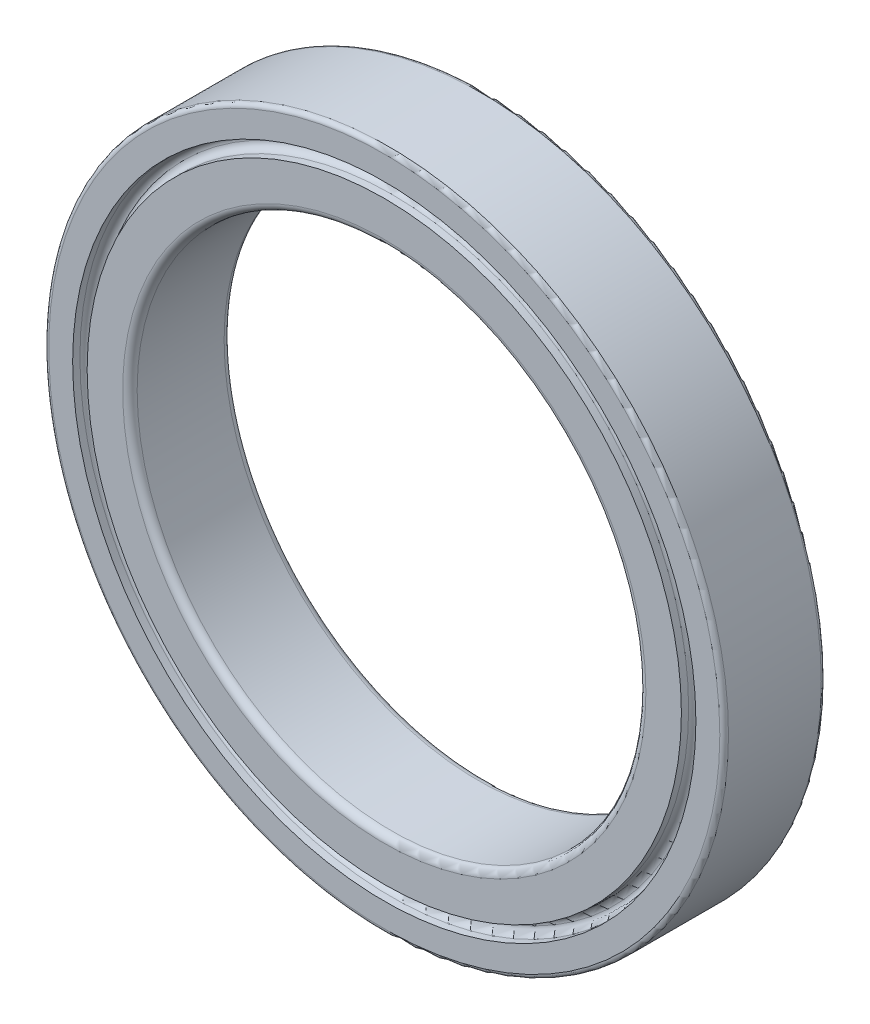
ISO-10303-21;
HEADER;
FILE_DESCRIPTION(('STEP AP214'),'2;1');
FILE_NAME('part.step','',(''),(''),'','','');
FILE_SCHEMA(('AUTOMOTIVE_DESIGN { 1 0 10303 214 1 1 1 1 }'));
ENDSEC;
DATA;
#1=APPLICATION_CONTEXT('core data for automotive mechanical design processes');
#2=APPLICATION_PROTOCOL_DEFINITION('international standard','automotive_design',2000,#1);
#3=PRODUCT_CONTEXT('',#1,'mechanical');
#4=PRODUCT('Part','Part','',(#3));
#5=PRODUCT_RELATED_PRODUCT_CATEGORY('part','',(#4));
#6=PRODUCT_DEFINITION_FORMATION('','',#4);
#7=PRODUCT_DEFINITION_CONTEXT('part definition',#1,'design');
#8=PRODUCT_DEFINITION('design','',#6,#7);
#9=PRODUCT_DEFINITION_SHAPE('','',#8);
#10=(LENGTH_UNIT() NAMED_UNIT(*) SI_UNIT(.MILLI.,.METRE.));
#11=(NAMED_UNIT(*) PLANE_ANGLE_UNIT() SI_UNIT($,.RADIAN.));
#12=(NAMED_UNIT(*) SI_UNIT($,.STERADIAN.) SOLID_ANGLE_UNIT());
#13=UNCERTAINTY_MEASURE_WITH_UNIT(LENGTH_MEASURE(1.E-05),#10,'distance_accuracy_value','');
#14=(GEOMETRIC_REPRESENTATION_CONTEXT(3) GLOBAL_UNCERTAINTY_ASSIGNED_CONTEXT((#13)) GLOBAL_UNIT_ASSIGNED_CONTEXT((#10,
#11,#12)) REPRESENTATION_CONTEXT('',''));
#15=CARTESIAN_POINT('',(0.,0.,0.));
#16=DIRECTION('',(0.,0.,1.));
#17=DIRECTION('',(1.,0.,0.));
#18=AXIS2_PLACEMENT_3D('',#15,#16,#17);
#19=CARTESIAN_POINT('',(0.,0.,0.));
#20=DIRECTION('',(0.,0.,1.));
#21=DIRECTION('',(1.,0.,0.));
#22=AXIS2_PLACEMENT_3D('',#19,#20,#21);
#23=PLANE('',#22);
#24=CARTESIAN_POINT('',(0.,0.,0.));
#25=DIRECTION('',(0.,0.,1.));
#26=DIRECTION('',(1.,0.,0.));
#27=AXIS2_PLACEMENT_3D('',#24,#25,#26);
#28=CIRCLE('',#27,18.05);
#29=CARTESIAN_POINT('',(18.05,0.,0.));
#30=VERTEX_POINT('',#29);
#31=EDGE_CURVE('E89',#30,#30,#28,.T.);
#32=ORIENTED_EDGE('',*,*,#31,.T.);
#33=EDGE_LOOP('',(#32));
#34=FACE_BOUND('',#33,.T.);
#35=CARTESIAN_POINT('',(0.,0.,0.));
#36=DIRECTION('',(0.,0.,-1.));
#37=DIRECTION('',(-1.,0.,0.));
#38=AXIS2_PLACEMENT_3D('',#35,#36,#37);
#39=CIRCLE('',#38,21.);
#40=CARTESIAN_POINT('',(-21.,0.,0.));
#41=VERTEX_POINT('',#40);
#42=EDGE_CURVE('E99',#41,#41,#39,.T.);
#43=ORIENTED_EDGE('',*,*,#42,.T.);
#44=EDGE_LOOP('',(#43));
#45=FACE_BOUND('',#44,.T.);
#46=ADVANCED_FACE('F43',(#34,#45),#23,.F.);
#47=CARTESIAN_POINT('',(0.,0.,7.));
#48=DIRECTION('',(0.,0.,1.));
#49=DIRECTION('',(1.,0.,0.));
#50=AXIS2_PLACEMENT_3D('',#47,#48,#49);
#51=PLANE('',#50);
#52=CARTESIAN_POINT('',(0.,0.,7.));
#53=DIRECTION('',(0.,0.,1.));
#54=DIRECTION('',(1.,0.,0.));
#55=AXIS2_PLACEMENT_3D('',#52,#53,#54);
#56=CIRCLE('',#55,18.05);
#57=CARTESIAN_POINT('',(18.05,0.,7.));
#58=VERTEX_POINT('',#57);
#59=EDGE_CURVE('E80',#58,#58,#56,.F.);
#60=ORIENTED_EDGE('',*,*,#59,.T.);
#61=EDGE_LOOP('',(#60));
#62=FACE_BOUND('',#61,.T.);
#63=CARTESIAN_POINT('',(0.,0.,7.));
#64=DIRECTION('',(0.,0.,1.));
#65=DIRECTION('',(1.,0.,0.));
#66=AXIS2_PLACEMENT_3D('',#63,#64,#65);
#67=CIRCLE('',#66,20.5);
#68=CARTESIAN_POINT('',(20.5,0.,7.));
#69=VERTEX_POINT('',#68);
#70=EDGE_CURVE('E73',#69,#69,#67,.T.);
#71=ORIENTED_EDGE('',*,*,#70,.T.);
#72=EDGE_LOOP('',(#71));
#73=FACE_BOUND('',#72,.T.);
#74=ADVANCED_FACE('F119',(#62,#73),#51,.T.);
#75=CARTESIAN_POINT('',(0.,0.,7.));
#76=DIRECTION('',(0.,0.,-1.));
#77=DIRECTION('',(-1.,0.,0.));
#78=AXIS2_PLACEMENT_3D('',#75,#76,#77);
#79=CYLINDRICAL_SURFACE('',#78,23.45);
#80=CARTESIAN_POINT('',(0.,0.,6.7));
#81=DIRECTION('',(0.,0.,1.));
#82=DIRECTION('',(1.,0.,0.));
#83=AXIS2_PLACEMENT_3D('',#80,#81,#82);
#84=CIRCLE('',#83,23.45);
#85=CARTESIAN_POINT('',(23.45,0.,6.7));
#86=VERTEX_POINT('',#85);
#87=EDGE_CURVE('E60',#86,#86,#84,.F.);
#88=ORIENTED_EDGE('',*,*,#87,.T.);
#89=EDGE_LOOP('',(#88));
#90=FACE_BOUND('',#89,.T.);
#91=CARTESIAN_POINT('',(0.,0.,0.3));
#92=DIRECTION('',(0.,0.,1.));
#93=DIRECTION('',(1.,0.,0.));
#94=AXIS2_PLACEMENT_3D('',#91,#92,#93);
#95=CIRCLE('',#94,23.45);
#96=CARTESIAN_POINT('',(23.45,0.,0.3));
#97=VERTEX_POINT('',#96);
#98=EDGE_CURVE('E63',#97,#97,#95,.T.);
#99=ORIENTED_EDGE('',*,*,#98,.T.);
#100=EDGE_LOOP('',(#99));
#101=FACE_BOUND('',#100,.T.);
#102=ADVANCED_FACE('F126',(#90,#101),#79,.T.);
#103=CARTESIAN_POINT('',(0.,0.,7.));
#104=DIRECTION('',(0.,0.,1.));
#105=DIRECTION('',(1.,0.,0.));
#106=AXIS2_PLACEMENT_3D('',#103,#104,#105);
#107=CIRCLE('',#106,23.15);
#108=CARTESIAN_POINT('',(23.15,0.,7.));
#109=VERTEX_POINT('',#108);
#110=EDGE_CURVE('E66',#109,#109,#107,.T.);
#111=ORIENTED_EDGE('',*,*,#110,.T.);
#112=EDGE_LOOP('',(#111));
#113=FACE_BOUND('',#112,.T.);
#114=CARTESIAN_POINT('',(0.,0.,7.));
#115=DIRECTION('',(0.,0.,1.));
#116=DIRECTION('',(1.,0.,0.));
#117=AXIS2_PLACEMENT_3D('',#114,#115,#116);
#118=CIRCLE('',#117,21.5);
#119=CARTESIAN_POINT('',(21.5,0.,7.));
#120=VERTEX_POINT('',#119);
#121=EDGE_CURVE('E92',#120,#120,#118,.T.);
#122=ORIENTED_EDGE('',*,*,#121,.F.);
#123=EDGE_LOOP('',(#122));
#124=FACE_BOUND('',#123,.T.);
#125=ADVANCED_FACE('F129',(#113,#124),#51,.T.);
#126=CARTESIAN_POINT('',(0.,0.,0.));
#127=DIRECTION('',(0.,0.,-1.));
#128=DIRECTION('',(-1.,0.,0.));
#129=AXIS2_PLACEMENT_3D('',#126,#127,#128);
#130=CIRCLE('',#129,22.);
#131=CARTESIAN_POINT('',(-22.,0.,0.));
#132=VERTEX_POINT('',#131);
#133=EDGE_CURVE('E74',#132,#132,#130,.T.);
#134=ORIENTED_EDGE('',*,*,#133,.F.);
#135=EDGE_LOOP('',(#134));
#136=FACE_BOUND('',#135,.T.);
#137=CARTESIAN_POINT('',(0.,0.,0.));
#138=DIRECTION('',(0.,0.,1.));
#139=DIRECTION('',(1.,0.,0.));
#140=AXIS2_PLACEMENT_3D('',#137,#138,#139);
#141=CIRCLE('',#140,23.15);
#142=CARTESIAN_POINT('',(23.15,0.,0.));
#143=VERTEX_POINT('',#142);
#144=EDGE_CURVE('E55',#143,#143,#141,.F.);
#145=ORIENTED_EDGE('',*,*,#144,.T.);
#146=EDGE_LOOP('',(#145));
#147=FACE_BOUND('',#146,.T.);
#148=ADVANCED_FACE('F122',(#136,#147),#23,.F.);
#149=CARTESIAN_POINT('',(0.,0.,0.));
#150=DIRECTION('',(0.,0.,1.));
#151=DIRECTION('',(1.,0.,0.));
#152=AXIS2_PLACEMENT_3D('',#149,#150,#151);
#153=CYLINDRICAL_SURFACE('',#152,17.55);
#154=CARTESIAN_POINT('',(0.,0.,0.5));
#155=DIRECTION('',(0.,0.,1.));
#156=DIRECTION('',(1.,0.,0.));
#157=AXIS2_PLACEMENT_3D('',#154,#155,#156);
#158=CIRCLE('',#157,17.55);
#159=CARTESIAN_POINT('',(17.55,0.,0.5));
#160=VERTEX_POINT('',#159);
#161=EDGE_CURVE('E83',#160,#160,#158,.F.);
#162=ORIENTED_EDGE('',*,*,#161,.T.);
#163=EDGE_LOOP('',(#162));
#164=FACE_BOUND('',#163,.T.);
#165=CARTESIAN_POINT('',(0.,0.,6.5));
#166=DIRECTION('',(0.,0.,1.));
#167=DIRECTION('',(1.,0.,0.));
#168=AXIS2_PLACEMENT_3D('',#165,#166,#167);
#169=CIRCLE('',#168,17.55);
#170=CARTESIAN_POINT('',(17.55,0.,6.5));
#171=VERTEX_POINT('',#170);
#172=EDGE_CURVE('E86',#171,#171,#169,.T.);
#173=ORIENTED_EDGE('',*,*,#172,.T.);
#174=EDGE_LOOP('',(#173));
#175=FACE_BOUND('',#174,.T.);
#176=ADVANCED_FACE('F132',(#164,#175),#153,.F.);
#177=CARTESIAN_POINT('',(0.,0.,0.5));
#178=DIRECTION('',(0.,0.,1.));
#179=DIRECTION('',(1.,0.,0.));
#180=AXIS2_PLACEMENT_3D('',#177,#178,#179);
#181=TOROIDAL_SURFACE('',#180,18.05,0.5);
#182=ORIENTED_EDGE('',*,*,#161,.F.);
#183=EDGE_LOOP('',(#182));
#184=FACE_BOUND('',#183,.T.);
#185=ORIENTED_EDGE('',*,*,#31,.F.);
#186=EDGE_LOOP('',(#185));
#187=FACE_BOUND('',#186,.T.);
#188=ADVANCED_FACE('F138',(#184,#187),#181,.T.);
#189=CARTESIAN_POINT('',(0.,0.,6.5));
#190=DIRECTION('',(0.,0.,1.));
#191=DIRECTION('',(1.,0.,0.));
#192=AXIS2_PLACEMENT_3D('',#189,#190,#191);
#193=TOROIDAL_SURFACE('',#192,18.05,0.5);
#194=ORIENTED_EDGE('',*,*,#59,.F.);
#195=EDGE_LOOP('',(#194));
#196=FACE_BOUND('',#195,.T.);
#197=ORIENTED_EDGE('',*,*,#172,.F.);
#198=EDGE_LOOP('',(#197));
#199=FACE_BOUND('',#198,.T.);
#200=ADVANCED_FACE('F160',(#196,#199),#193,.T.);
#201=CARTESIAN_POINT('',(0.,0.,6.));
#202=DIRECTION('',(0.,0.,1.));
#203=DIRECTION('',(1.,0.,0.));
#204=AXIS2_PLACEMENT_3D('',#201,#202,#203);
#205=CYLINDRICAL_SURFACE('',#204,21.5);
#206=CARTESIAN_POINT('',(0.,0.,6.5));
#207=DIRECTION('',(0.,0.,1.));
#208=DIRECTION('',(1.,0.,0.));
#209=AXIS2_PLACEMENT_3D('',#206,#207,#208);
#210=CIRCLE('',#209,21.5);
#211=CARTESIAN_POINT('',(21.5,0.,6.5));
#212=VERTEX_POINT('',#211);
#213=EDGE_CURVE('E77',#212,#212,#210,.F.);
#214=ORIENTED_EDGE('',*,*,#213,.T.);
#215=EDGE_LOOP('',(#214));
#216=FACE_BOUND('',#215,.T.);
#217=ORIENTED_EDGE('',*,*,#121,.T.);
#218=EDGE_LOOP('',(#217));
#219=FACE_BOUND('',#218,.T.);
#220=ADVANCED_FACE('F164',(#216,#219),#205,.F.);
#221=CARTESIAN_POINT('',(0.,0.,6.));
#222=DIRECTION('',(0.,0.,1.));
#223=DIRECTION('',(1.,0.,0.));
#224=AXIS2_PLACEMENT_3D('',#221,#222,#223);
#225=CYLINDRICAL_SURFACE('',#224,20.5);
#226=CARTESIAN_POINT('',(0.,0.,6.5));
#227=DIRECTION('',(0.,0.,1.));
#228=DIRECTION('',(1.,0.,0.));
#229=AXIS2_PLACEMENT_3D('',#226,#227,#228);
#230=CIRCLE('',#229,20.5);
#231=CARTESIAN_POINT('',(20.5,0.,6.5));
#232=VERTEX_POINT('',#231);
#233=EDGE_CURVE('E69',#232,#232,#230,.T.);
#234=ORIENTED_EDGE('',*,*,#233,.T.);
#235=EDGE_LOOP('',(#234));
#236=FACE_BOUND('',#235,.T.);
#237=ORIENTED_EDGE('',*,*,#70,.F.);
#238=EDGE_LOOP('',(#237));
#239=FACE_BOUND('',#238,.T.);
#240=ADVANCED_FACE('F173',(#236,#239),#225,.T.);
#241=CARTESIAN_POINT('',(0.,0.,6.5));
#242=DIRECTION('',(0.,0.,1.));
#243=DIRECTION('',(1.,0.,0.));
#244=AXIS2_PLACEMENT_3D('',#241,#242,#243);
#245=TOROIDAL_SURFACE('',#244,21.,0.5);
#246=ORIENTED_EDGE('',*,*,#233,.F.);
#247=EDGE_LOOP('',(#246));
#248=FACE_BOUND('',#247,.T.);
#249=CARTESIAN_POINT('',(0.,0.,6.));
#250=DIRECTION('',(0.,0.,1.));
#251=DIRECTION('',(1.,0.,0.));
#252=AXIS2_PLACEMENT_3D('',#249,#250,#251);
#253=CIRCLE('',#252,21.);
#254=CARTESIAN_POINT('',(21.,0.,6.));
#255=VERTEX_POINT('',#254);
#256=EDGE_CURVE('E70',#255,#255,#253,.F.);
#257=ORIENTED_EDGE('',*,*,#256,.F.);
#258=EDGE_LOOP('',(#257));
#259=FACE_BOUND('',#258,.T.);
#260=ADVANCED_FACE('F169',(#248,#259),#245,.F.);
#261=CARTESIAN_POINT('',(0.,0.,6.5));
#262=DIRECTION('',(0.,0.,1.));
#263=DIRECTION('',(1.,0.,0.));
#264=AXIS2_PLACEMENT_3D('',#261,#262,#263);
#265=TOROIDAL_SURFACE('',#264,21.,0.5);
#266=ORIENTED_EDGE('',*,*,#213,.F.);
#267=EDGE_LOOP('',(#266));
#268=FACE_BOUND('',#267,.T.);
#269=ORIENTED_EDGE('',*,*,#256,.T.);
#270=EDGE_LOOP('',(#269));
#271=FACE_BOUND('',#270,.T.);
#272=ADVANCED_FACE('F166',(#268,#271),#265,.F.);
#273=CARTESIAN_POINT('',(0.,0.,6.7));
#274=DIRECTION('',(0.,0.,1.));
#275=DIRECTION('',(1.,0.,0.));
#276=AXIS2_PLACEMENT_3D('',#273,#274,#275);
#277=TOROIDAL_SURFACE('',#276,23.15,0.3);
#278=ORIENTED_EDGE('',*,*,#87,.F.);
#279=EDGE_LOOP('',(#278));
#280=FACE_BOUND('',#279,.T.);
#281=ORIENTED_EDGE('',*,*,#110,.F.);
#282=EDGE_LOOP('',(#281));
#283=FACE_BOUND('',#282,.T.);
#284=ADVANCED_FACE('F149',(#280,#283),#277,.T.);
#285=CARTESIAN_POINT('',(0.,0.,0.3));
#286=DIRECTION('',(0.,0.,1.));
#287=DIRECTION('',(1.,0.,0.));
#288=AXIS2_PLACEMENT_3D('',#285,#286,#287);
#289=TOROIDAL_SURFACE('',#288,23.15,0.3);
#290=ORIENTED_EDGE('',*,*,#144,.F.);
#291=EDGE_LOOP('',(#290));
#292=FACE_BOUND('',#291,.T.);
#293=ORIENTED_EDGE('',*,*,#98,.F.);
#294=EDGE_LOOP('',(#293));
#295=FACE_BOUND('',#294,.T.);
#296=ADVANCED_FACE('F146',(#292,#295),#289,.T.);
#297=CARTESIAN_POINT('',(0.,0.,1.));
#298=DIRECTION('',(0.,0.,-1.));
#299=DIRECTION('',(-1.,0.,0.));
#300=AXIS2_PLACEMENT_3D('',#297,#298,#299);
#301=CYLINDRICAL_SURFACE('',#300,22.);
#302=CARTESIAN_POINT('',(0.,0.,0.5));
#303=DIRECTION('',(0.,0.,-1.));
#304=DIRECTION('',(-1.,0.,0.));
#305=AXIS2_PLACEMENT_3D('',#302,#303,#304);
#306=CIRCLE('',#305,22.);
#307=CARTESIAN_POINT('',(-22.,0.,0.5));
#308=VERTEX_POINT('',#307);
#309=EDGE_CURVE('E51',#308,#308,#306,.F.);
#310=ORIENTED_EDGE('',*,*,#309,.T.);
#311=EDGE_LOOP('',(#310));
#312=FACE_BOUND('',#311,.T.);
#313=ORIENTED_EDGE('',*,*,#133,.T.);
#314=EDGE_LOOP('',(#313));
#315=FACE_BOUND('',#314,.T.);
#316=ADVANCED_FACE('F116',(#312,#315),#301,.F.);
#317=CARTESIAN_POINT('',(0.,0.,1.));
#318=DIRECTION('',(0.,0.,-1.));
#319=DIRECTION('',(-1.,0.,0.));
#320=AXIS2_PLACEMENT_3D('',#317,#318,#319);
#321=CYLINDRICAL_SURFACE('',#320,21.);
#322=CARTESIAN_POINT('',(0.,0.,0.5));
#323=DIRECTION('',(0.,0.,-1.));
#324=DIRECTION('',(-1.,0.,0.));
#325=AXIS2_PLACEMENT_3D('',#322,#323,#324);
#326=CIRCLE('',#325,21.);
#327=CARTESIAN_POINT('',(-21.,0.,0.5));
#328=VERTEX_POINT('',#327);
#329=EDGE_CURVE('E11',#328,#328,#326,.T.);
#330=ORIENTED_EDGE('',*,*,#329,.T.);
#331=EDGE_LOOP('',(#330));
#332=FACE_BOUND('',#331,.T.);
#333=ORIENTED_EDGE('',*,*,#42,.F.);
#334=EDGE_LOOP('',(#333));
#335=FACE_BOUND('',#334,.T.);
#336=ADVANCED_FACE('F109',(#332,#335),#321,.T.);
#337=CARTESIAN_POINT('',(0.,0.,0.5));
#338=DIRECTION('',(0.,0.,-1.));
#339=DIRECTION('',(-1.,0.,0.));
#340=AXIS2_PLACEMENT_3D('',#337,#338,#339);
#341=TOROIDAL_SURFACE('',#340,21.5,0.5);
#342=ORIENTED_EDGE('',*,*,#329,.F.);
#343=EDGE_LOOP('',(#342));
#344=FACE_BOUND('',#343,.T.);
#345=CARTESIAN_POINT('',(0.,0.,1.));
#346=DIRECTION('',(0.,0.,-1.));
#347=DIRECTION('',(-1.,0.,0.));
#348=AXIS2_PLACEMENT_3D('',#345,#346,#347);
#349=CIRCLE('',#348,21.5);
#350=CARTESIAN_POINT('',(-21.5,0.,1.));
#351=VERTEX_POINT('',#350);
#352=EDGE_CURVE('E47',#351,#351,#349,.F.);
#353=ORIENTED_EDGE('',*,*,#352,.F.);
#354=EDGE_LOOP('',(#353));
#355=FACE_BOUND('',#354,.T.);
#356=ADVANCED_FACE('F45',(#344,#355),#341,.F.);
#357=CARTESIAN_POINT('',(0.,0.,0.5));
#358=DIRECTION('',(0.,0.,-1.));
#359=DIRECTION('',(-1.,0.,0.));
#360=AXIS2_PLACEMENT_3D('',#357,#358,#359);
#361=TOROIDAL_SURFACE('',#360,21.5,0.5);
#362=ORIENTED_EDGE('',*,*,#309,.F.);
#363=EDGE_LOOP('',(#362));
#364=FACE_BOUND('',#363,.T.);
#365=ORIENTED_EDGE('',*,*,#352,.T.);
#366=EDGE_LOOP('',(#365));
#367=FACE_BOUND('',#366,.T.);
#368=ADVANCED_FACE('F106',(#364,#367),#361,.F.);
#369=CLOSED_SHELL('',(#46,#74,#102,#125,#148,#176,#188,#200,#220,#240,#260,#272,#284,#296,#316,
#336,#356,#368));
#370=MANIFOLD_SOLID_BREP('B2',#369);
#371=ADVANCED_BREP_SHAPE_REPRESENTATION('',(#18,#370),#14);
#372=SHAPE_DEFINITION_REPRESENTATION(#9,#371);
ENDSEC;
END-ISO-10303-21;
